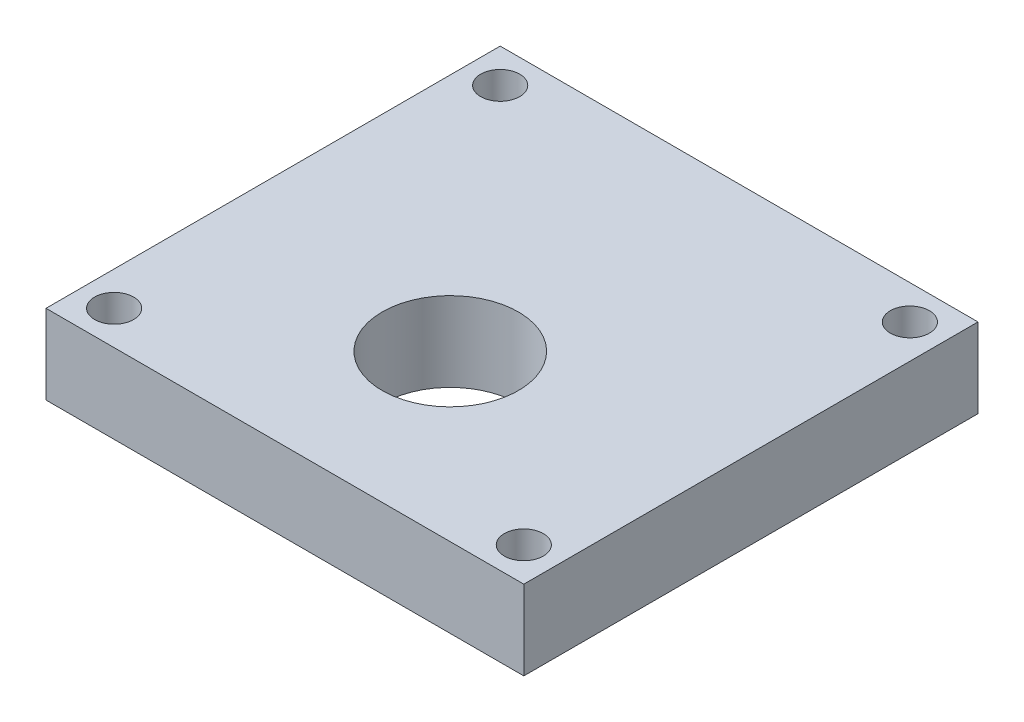
ISO-10303-21;
HEADER;
FILE_DESCRIPTION(('STEP AP214'),'2;1');
FILE_NAME('part.step','',(''),(''),'','','');
FILE_SCHEMA(('AUTOMOTIVE_DESIGN { 1 0 10303 214 1 1 1 1 }'));
ENDSEC;
DATA;
#1=APPLICATION_CONTEXT('core data for automotive mechanical design processes');
#2=APPLICATION_PROTOCOL_DEFINITION('international standard','automotive_design',2000,#1);
#3=PRODUCT_CONTEXT('',#1,'mechanical');
#4=PRODUCT('Part','Part','',(#3));
#5=PRODUCT_RELATED_PRODUCT_CATEGORY('part','',(#4));
#6=PRODUCT_DEFINITION_FORMATION('','',#4);
#7=PRODUCT_DEFINITION_CONTEXT('part definition',#1,'design');
#8=PRODUCT_DEFINITION('design','',#6,#7);
#9=PRODUCT_DEFINITION_SHAPE('','',#8);
#10=(LENGTH_UNIT() NAMED_UNIT(*) SI_UNIT(.MILLI.,.METRE.));
#11=(NAMED_UNIT(*) PLANE_ANGLE_UNIT() SI_UNIT($,.RADIAN.));
#12=(NAMED_UNIT(*) SI_UNIT($,.STERADIAN.) SOLID_ANGLE_UNIT());
#13=UNCERTAINTY_MEASURE_WITH_UNIT(LENGTH_MEASURE(1.E-05),#10,'distance_accuracy_value','');
#14=(GEOMETRIC_REPRESENTATION_CONTEXT(3) GLOBAL_UNCERTAINTY_ASSIGNED_CONTEXT((#13)) GLOBAL_UNIT_ASSIGNED_CONTEXT((#10,
#11,#12)) REPRESENTATION_CONTEXT('',''));
#15=CARTESIAN_POINT('',(0.,0.,0.));
#16=DIRECTION('',(0.,0.,1.));
#17=DIRECTION('',(1.,0.,0.));
#18=AXIS2_PLACEMENT_3D('',#15,#16,#17);
#19=CARTESIAN_POINT('',(-8.89,40.64,50.8));
#20=DIRECTION('',(1.,0.,0.));
#21=DIRECTION('',(0.,0.,-1.));
#22=AXIS2_PLACEMENT_3D('',#19,#20,#21);
#23=PLANE('',#22);
#24=DIRECTION('',(0.,-1.,0.));
#25=VECTOR('',#24,1.);
#26=CARTESIAN_POINT('',(-8.89,40.64,0.));
#27=LINE('',#26,#25);
#28=CARTESIAN_POINT('',(-8.89,49.53,0.));
#29=VERTEX_POINT('',#28);
#30=CARTESIAN_POINT('',(-8.89,40.64,0.));
#31=VERTEX_POINT('',#30);
#32=EDGE_CURVE('E83',#29,#31,#27,.T.);
#33=ORIENTED_EDGE('',*,*,#32,.T.);
#34=DIRECTION('',(0.,0.,-1.));
#35=VECTOR('',#34,1.);
#36=CARTESIAN_POINT('',(-8.89,40.64,50.8));
#37=LINE('',#36,#35);
#38=CARTESIAN_POINT('',(-8.89,40.64,50.8));
#39=VERTEX_POINT('',#38);
#40=EDGE_CURVE('E11',#39,#31,#37,.T.);
#41=ORIENTED_EDGE('',*,*,#40,.F.);
#42=DIRECTION('',(0.,-1.,0.));
#43=VECTOR('',#42,1.);
#44=CARTESIAN_POINT('',(-8.89,49.53,50.8));
#45=LINE('',#44,#43);
#46=CARTESIAN_POINT('',(-8.89,49.53,50.8));
#47=VERTEX_POINT('',#46);
#48=EDGE_CURVE('E88',#47,#39,#45,.T.);
#49=ORIENTED_EDGE('',*,*,#48,.F.);
#50=DIRECTION('',(0.,0.,-1.));
#51=VECTOR('',#50,1.);
#52=CARTESIAN_POINT('',(-8.89,49.53,50.8));
#53=LINE('',#52,#51);
#54=EDGE_CURVE('E108',#47,#29,#53,.T.);
#55=ORIENTED_EDGE('',*,*,#54,.T.);
#56=EDGE_LOOP('',(#33,#41,#49,#55));
#57=FACE_BOUND('',#56,.T.);
#58=ADVANCED_FACE('F43',(#57),#23,.F.);
#59=CARTESIAN_POINT('',(44.5516,40.64,50.8));
#60=DIRECTION('',(0.,1.,0.));
#61=DIRECTION('',(0.,0.,1.));
#62=AXIS2_PLACEMENT_3D('',#59,#60,#61);
#63=PLANE('',#62);
#64=CARTESIAN_POINT('',(-5.08,40.64,46.99));
#65=DIRECTION('',(0.,1.,0.));
#66=DIRECTION('',(-1.,0.,0.));
#67=AXIS2_PLACEMENT_3D('',#64,#65,#66);
#68=CIRCLE('',#67,2.1828125);
#69=CARTESIAN_POINT('',(-7.2628125,40.64,46.99));
#70=VERTEX_POINT('',#69);
#71=EDGE_CURVE('E174',#70,#70,#68,.T.);
#72=ORIENTED_EDGE('',*,*,#71,.T.);
#73=EDGE_LOOP('',(#72));
#74=FACE_BOUND('',#73,.T.);
#75=CARTESIAN_POINT('',(40.7416,40.64,3.81));
#76=DIRECTION('',(0.,1.,0.));
#77=DIRECTION('',(-1.,0.,0.));
#78=AXIS2_PLACEMENT_3D('',#75,#76,#77);
#79=CIRCLE('',#78,2.1828125);
#80=CARTESIAN_POINT('',(38.5587875,40.64,3.81));
#81=VERTEX_POINT('',#80);
#82=EDGE_CURVE('E165',#81,#81,#79,.T.);
#83=ORIENTED_EDGE('',*,*,#82,.T.);
#84=EDGE_LOOP('',(#83));
#85=FACE_BOUND('',#84,.T.);
#86=CARTESIAN_POINT('',(-5.08,40.64,3.81));
#87=DIRECTION('',(0.,1.,0.));
#88=DIRECTION('',(-1.,0.,0.));
#89=AXIS2_PLACEMENT_3D('',#86,#87,#88);
#90=CIRCLE('',#89,2.1828125);
#91=CARTESIAN_POINT('',(-7.2628125,40.64,3.81));
#92=VERTEX_POINT('',#91);
#93=EDGE_CURVE('E181',#92,#92,#90,.T.);
#94=ORIENTED_EDGE('',*,*,#93,.T.);
#95=EDGE_LOOP('',(#94));
#96=FACE_BOUND('',#95,.T.);
#97=CARTESIAN_POINT('',(40.7416,40.64,46.99));
#98=DIRECTION('',(0.,1.,0.));
#99=DIRECTION('',(-1.,0.,0.));
#100=AXIS2_PLACEMENT_3D('',#97,#98,#99);
#101=CIRCLE('',#100,2.1828125);
#102=CARTESIAN_POINT('',(38.5587875,40.64,46.99));
#103=VERTEX_POINT('',#102);
#104=EDGE_CURVE('E156',#103,#103,#101,.T.);
#105=ORIENTED_EDGE('',*,*,#104,.T.);
#106=EDGE_LOOP('',(#105));
#107=FACE_BOUND('',#106,.T.);
#108=CARTESIAN_POINT('',(17.8798,40.64,32.350999872));
#109=DIRECTION('',(0.,1.,0.));
#110=DIRECTION('',(0.,0.,1.));
#111=AXIS2_PLACEMENT_3D('',#108,#109,#110);
#112=CIRCLE('',#111,7.62);
#113=CARTESIAN_POINT('',(17.8798,40.64,39.970999872));
#114=VERTEX_POINT('',#113);
#115=EDGE_CURVE('E114',#114,#114,#112,.F.);
#116=ORIENTED_EDGE('',*,*,#115,.F.);
#117=EDGE_LOOP('',(#116));
#118=FACE_BOUND('',#117,.T.);
#119=DIRECTION('',(1.,0.,0.));
#120=VECTOR('',#119,1.);
#121=CARTESIAN_POINT('',(44.5516,40.64,0.));
#122=LINE('',#121,#120);
#123=CARTESIAN_POINT('',(44.5516,40.64,0.));
#124=VERTEX_POINT('',#123);
#125=EDGE_CURVE('E101',#31,#124,#122,.T.);
#126=ORIENTED_EDGE('',*,*,#125,.T.);
#127=DIRECTION('',(0.,0.,-1.));
#128=VECTOR('',#127,1.);
#129=CARTESIAN_POINT('',(44.5516,40.64,50.8));
#130=LINE('',#129,#128);
#131=CARTESIAN_POINT('',(44.5516,40.64,50.8));
#132=VERTEX_POINT('',#131);
#133=EDGE_CURVE('E52',#132,#124,#130,.T.);
#134=ORIENTED_EDGE('',*,*,#133,.F.);
#135=DIRECTION('',(1.,0.,0.));
#136=VECTOR('',#135,1.);
#137=CARTESIAN_POINT('',(44.5516,40.64,50.8));
#138=LINE('',#137,#136);
#139=EDGE_CURVE('E91',#39,#132,#138,.T.);
#140=ORIENTED_EDGE('',*,*,#139,.F.);
#141=ORIENTED_EDGE('',*,*,#40,.T.);
#142=EDGE_LOOP('',(#126,#134,#140,#141));
#143=FACE_BOUND('',#142,.T.);
#144=ADVANCED_FACE('F100',(#74,#85,#96,#107,#118,#143),#63,.F.);
#145=CARTESIAN_POINT('',(44.5516,46.99,50.8));
#146=DIRECTION('',(-1.,0.,0.));
#147=DIRECTION('',(0.,0.,1.));
#148=AXIS2_PLACEMENT_3D('',#145,#146,#147);
#149=PLANE('',#148);
#150=DIRECTION('',(0.,1.,0.));
#151=VECTOR('',#150,1.);
#152=CARTESIAN_POINT('',(44.5516,46.99,0.));
#153=LINE('',#152,#151);
#154=CARTESIAN_POINT('',(44.5516,49.53,0.));
#155=VERTEX_POINT('',#154);
#156=EDGE_CURVE('E76',#124,#155,#153,.T.);
#157=ORIENTED_EDGE('',*,*,#156,.T.);
#158=DIRECTION('',(0.,0.,-1.));
#159=VECTOR('',#158,1.);
#160=CARTESIAN_POINT('',(44.5516,49.53,50.8));
#161=LINE('',#160,#159);
#162=CARTESIAN_POINT('',(44.5516,49.53,50.8));
#163=VERTEX_POINT('',#162);
#164=EDGE_CURVE('E103',#163,#155,#161,.T.);
#165=ORIENTED_EDGE('',*,*,#164,.F.);
#166=DIRECTION('',(0.,1.,0.));
#167=VECTOR('',#166,1.);
#168=CARTESIAN_POINT('',(44.5516,40.64,50.8));
#169=LINE('',#168,#167);
#170=EDGE_CURVE('E95',#132,#163,#169,.T.);
#171=ORIENTED_EDGE('',*,*,#170,.F.);
#172=ORIENTED_EDGE('',*,*,#133,.T.);
#173=EDGE_LOOP('',(#157,#165,#171,#172));
#174=FACE_BOUND('',#173,.T.);
#175=ADVANCED_FACE('F104',(#174),#149,.F.);
#176=CARTESIAN_POINT('',(44.5516,49.53,50.8));
#177=DIRECTION('',(0.,-1.,0.));
#178=DIRECTION('',(1.,0.,0.));
#179=AXIS2_PLACEMENT_3D('',#176,#177,#178);
#180=PLANE('',#179);
#181=CARTESIAN_POINT('',(-5.08,49.53,46.99));
#182=DIRECTION('',(0.,1.,0.));
#183=DIRECTION('',(-1.,0.,0.));
#184=AXIS2_PLACEMENT_3D('',#181,#182,#183);
#185=CIRCLE('',#184,2.1828125);
#186=CARTESIAN_POINT('',(-7.2628125,49.53,46.99));
#187=VERTEX_POINT('',#186);
#188=EDGE_CURVE('E161',#187,#187,#185,.T.);
#189=ORIENTED_EDGE('',*,*,#188,.F.);
#190=EDGE_LOOP('',(#189));
#191=FACE_BOUND('',#190,.T.);
#192=CARTESIAN_POINT('',(40.7416,49.53,3.81));
#193=DIRECTION('',(0.,1.,0.));
#194=DIRECTION('',(-1.,0.,0.));
#195=AXIS2_PLACEMENT_3D('',#192,#193,#194);
#196=CIRCLE('',#195,2.1828125);
#197=CARTESIAN_POINT('',(38.5587875,49.53,3.81));
#198=VERTEX_POINT('',#197);
#199=EDGE_CURVE('E169',#198,#198,#196,.T.);
#200=ORIENTED_EDGE('',*,*,#199,.F.);
#201=EDGE_LOOP('',(#200));
#202=FACE_BOUND('',#201,.T.);
#203=CARTESIAN_POINT('',(-5.08,49.53,3.81));
#204=DIRECTION('',(0.,1.,0.));
#205=DIRECTION('',(-1.,0.,0.));
#206=AXIS2_PLACEMENT_3D('',#203,#204,#205);
#207=CIRCLE('',#206,2.1828125);
#208=CARTESIAN_POINT('',(-7.2628125,49.53,3.81));
#209=VERTEX_POINT('',#208);
#210=EDGE_CURVE('E170',#209,#209,#207,.T.);
#211=ORIENTED_EDGE('',*,*,#210,.F.);
#212=EDGE_LOOP('',(#211));
#213=FACE_BOUND('',#212,.T.);
#214=CARTESIAN_POINT('',(40.7416,49.53,46.99));
#215=DIRECTION('',(0.,1.,0.));
#216=DIRECTION('',(-1.,0.,0.));
#217=AXIS2_PLACEMENT_3D('',#214,#215,#216);
#218=CIRCLE('',#217,2.1828125);
#219=CARTESIAN_POINT('',(38.5587875,49.53,46.99));
#220=VERTEX_POINT('',#219);
#221=EDGE_CURVE('E157',#220,#220,#218,.T.);
#222=ORIENTED_EDGE('',*,*,#221,.F.);
#223=EDGE_LOOP('',(#222));
#224=FACE_BOUND('',#223,.T.);
#225=CARTESIAN_POINT('',(17.8798,49.53,32.350999872));
#226=DIRECTION('',(0.,1.,0.));
#227=DIRECTION('',(-1.,0.,0.));
#228=AXIS2_PLACEMENT_3D('',#225,#226,#227);
#229=CIRCLE('',#228,7.62);
#230=CARTESIAN_POINT('',(10.2598,49.53,32.350999872));
#231=VERTEX_POINT('',#230);
#232=EDGE_CURVE('E152',#231,#231,#229,.T.);
#233=ORIENTED_EDGE('',*,*,#232,.F.);
#234=EDGE_LOOP('',(#233));
#235=FACE_BOUND('',#234,.T.);
#236=DIRECTION('',(-1.,0.,0.));
#237=VECTOR('',#236,1.);
#238=CARTESIAN_POINT('',(44.5516,49.53,0.));
#239=LINE('',#238,#237);
#240=EDGE_CURVE('E119',#155,#29,#239,.T.);
#241=ORIENTED_EDGE('',*,*,#240,.T.);
#242=ORIENTED_EDGE('',*,*,#54,.F.);
#243=DIRECTION('',(-1.,0.,0.));
#244=VECTOR('',#243,1.);
#245=CARTESIAN_POINT('',(44.5516,49.53,50.8));
#246=LINE('',#245,#244);
#247=EDGE_CURVE('E60',#163,#47,#246,.T.);
#248=ORIENTED_EDGE('',*,*,#247,.F.);
#249=ORIENTED_EDGE('',*,*,#164,.T.);
#250=EDGE_LOOP('',(#241,#242,#248,#249));
#251=FACE_BOUND('',#250,.T.);
#252=ADVANCED_FACE('F127',(#191,#202,#213,#224,#235,#251),#180,.F.);
#253=CARTESIAN_POINT('',(0.,0.,50.8));
#254=DIRECTION('',(0.,0.,-1.));
#255=DIRECTION('',(-1.,0.,0.));
#256=AXIS2_PLACEMENT_3D('',#253,#254,#255);
#257=PLANE('',#256);
#258=ORIENTED_EDGE('',*,*,#48,.T.);
#259=ORIENTED_EDGE('',*,*,#139,.T.);
#260=ORIENTED_EDGE('',*,*,#170,.T.);
#261=ORIENTED_EDGE('',*,*,#247,.T.);
#262=EDGE_LOOP('',(#258,#259,#260,#261));
#263=FACE_BOUND('',#262,.T.);
#264=ADVANCED_FACE('F93',(#263),#257,.F.);
#265=CARTESIAN_POINT('',(0.,0.,0.));
#266=DIRECTION('',(0.,0.,-1.));
#267=DIRECTION('',(-1.,0.,0.));
#268=AXIS2_PLACEMENT_3D('',#265,#266,#267);
#269=PLANE('',#268);
#270=ORIENTED_EDGE('',*,*,#32,.F.);
#271=ORIENTED_EDGE('',*,*,#240,.F.);
#272=ORIENTED_EDGE('',*,*,#156,.F.);
#273=ORIENTED_EDGE('',*,*,#125,.F.);
#274=EDGE_LOOP('',(#270,#271,#272,#273));
#275=FACE_BOUND('',#274,.T.);
#276=ADVANCED_FACE('F128',(#275),#269,.T.);
#277=CARTESIAN_POINT('',(17.8798,40.639,32.350999872));
#278=DIRECTION('',(0.,1.,0.));
#279=DIRECTION('',(-1.,0.,0.));
#280=AXIS2_PLACEMENT_3D('',#277,#278,#279);
#281=CYLINDRICAL_SURFACE('',#280,7.62);
#282=ORIENTED_EDGE('',*,*,#232,.T.);
#283=EDGE_LOOP('',(#282));
#284=FACE_BOUND('',#283,.T.);
#285=ORIENTED_EDGE('',*,*,#115,.T.);
#286=EDGE_LOOP('',(#285));
#287=FACE_BOUND('',#286,.T.);
#288=ADVANCED_FACE('F130',(#284,#287),#281,.F.);
#289=CARTESIAN_POINT('',(40.7416,40.64,46.99));
#290=DIRECTION('',(0.,1.,0.));
#291=DIRECTION('',(-1.,0.,0.));
#292=AXIS2_PLACEMENT_3D('',#289,#290,#291);
#293=CYLINDRICAL_SURFACE('',#292,2.1828125);
#294=ORIENTED_EDGE('',*,*,#104,.F.);
#295=EDGE_LOOP('',(#294));
#296=FACE_BOUND('',#295,.T.);
#297=ORIENTED_EDGE('',*,*,#221,.T.);
#298=EDGE_LOOP('',(#297));
#299=FACE_BOUND('',#298,.T.);
#300=ADVANCED_FACE('F136',(#296,#299),#293,.F.);
#301=CARTESIAN_POINT('',(-5.08,40.64,3.81));
#302=DIRECTION('',(0.,1.,0.));
#303=DIRECTION('',(-1.,0.,0.));
#304=AXIS2_PLACEMENT_3D('',#301,#302,#303);
#305=CYLINDRICAL_SURFACE('',#304,2.1828125);
#306=ORIENTED_EDGE('',*,*,#93,.F.);
#307=EDGE_LOOP('',(#306));
#308=FACE_BOUND('',#307,.T.);
#309=ORIENTED_EDGE('',*,*,#210,.T.);
#310=EDGE_LOOP('',(#309));
#311=FACE_BOUND('',#310,.T.);
#312=ADVANCED_FACE('F189',(#308,#311),#305,.F.);
#313=CARTESIAN_POINT('',(40.7416,40.64,3.81));
#314=DIRECTION('',(0.,1.,0.));
#315=DIRECTION('',(-1.,0.,0.));
#316=AXIS2_PLACEMENT_3D('',#313,#314,#315);
#317=CYLINDRICAL_SURFACE('',#316,2.1828125);
#318=ORIENTED_EDGE('',*,*,#82,.F.);
#319=EDGE_LOOP('',(#318));
#320=FACE_BOUND('',#319,.T.);
#321=ORIENTED_EDGE('',*,*,#199,.T.);
#322=EDGE_LOOP('',(#321));
#323=FACE_BOUND('',#322,.T.);
#324=ADVANCED_FACE('F207',(#320,#323),#317,.F.);
#325=CARTESIAN_POINT('',(-5.08,40.64,46.99));
#326=DIRECTION('',(0.,1.,0.));
#327=DIRECTION('',(-1.,0.,0.));
#328=AXIS2_PLACEMENT_3D('',#325,#326,#327);
#329=CYLINDRICAL_SURFACE('',#328,2.1828125);
#330=ORIENTED_EDGE('',*,*,#71,.F.);
#331=EDGE_LOOP('',(#330));
#332=FACE_BOUND('',#331,.T.);
#333=ORIENTED_EDGE('',*,*,#188,.T.);
#334=EDGE_LOOP('',(#333));
#335=FACE_BOUND('',#334,.T.);
#336=ADVANCED_FACE('F214',(#332,#335),#329,.F.);
#337=CLOSED_SHELL('',(#58,#144,#175,#252,#264,#276,#288,#300,#312,#324,#336));
#338=MANIFOLD_SOLID_BREP('B2',#337);
#339=ADVANCED_BREP_SHAPE_REPRESENTATION('',(#18,#338),#14);
#340=SHAPE_DEFINITION_REPRESENTATION(#9,#339);
ENDSEC;
END-ISO-10303-21;
